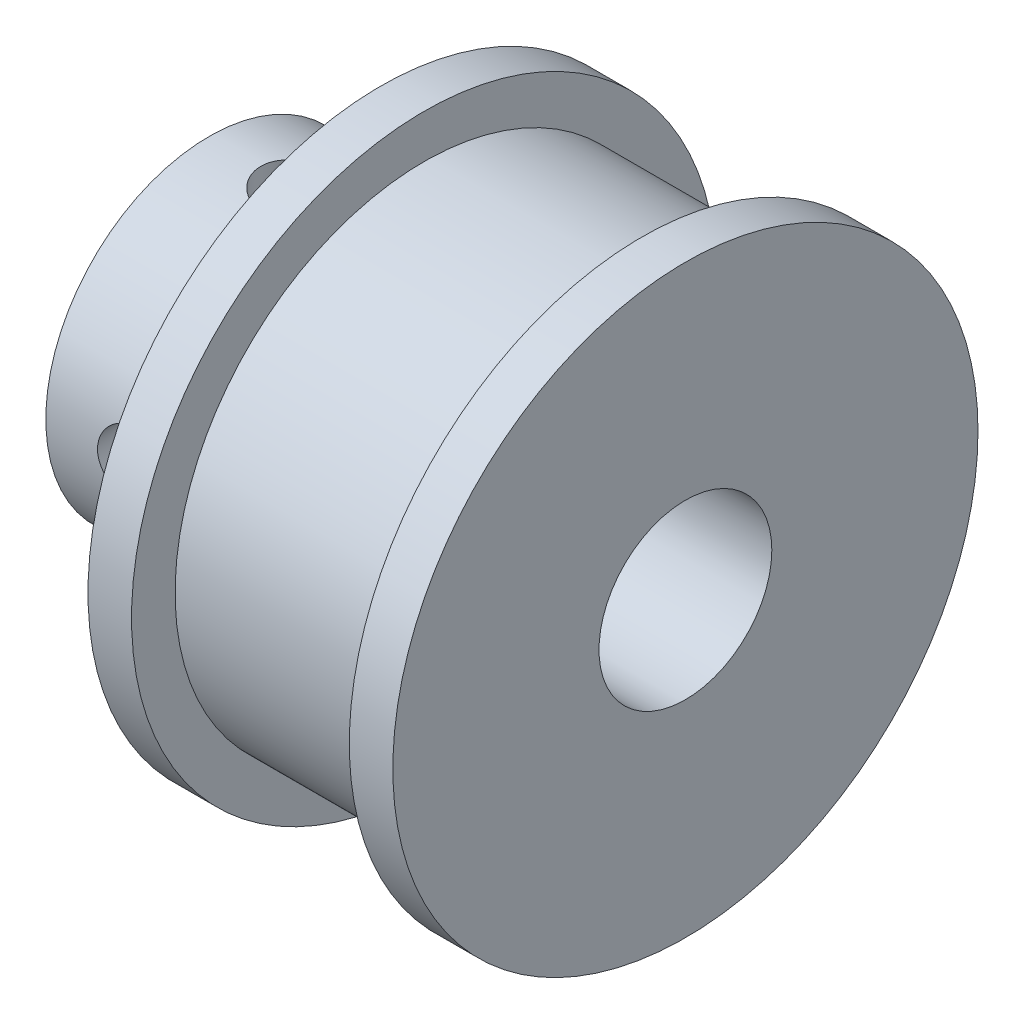
ISO-10303-21;
HEADER;
FILE_DESCRIPTION(('STEP AP214'),'2;1');
FILE_NAME('part.step','',(''),(''),'','','');
FILE_SCHEMA(('AUTOMOTIVE_DESIGN { 1 0 10303 214 1 1 1 1 }'));
ENDSEC;
DATA;
#1=APPLICATION_CONTEXT('core data for automotive mechanical design processes');
#2=APPLICATION_PROTOCOL_DEFINITION('international standard','automotive_design',2000,#1);
#3=PRODUCT_CONTEXT('',#1,'mechanical');
#4=PRODUCT('Part','Part','',(#3));
#5=PRODUCT_RELATED_PRODUCT_CATEGORY('part','',(#4));
#6=PRODUCT_DEFINITION_FORMATION('','',#4);
#7=PRODUCT_DEFINITION_CONTEXT('part definition',#1,'design');
#8=PRODUCT_DEFINITION('design','',#6,#7);
#9=PRODUCT_DEFINITION_SHAPE('','',#8);
#10=(LENGTH_UNIT() NAMED_UNIT(*) SI_UNIT(.MILLI.,.METRE.));
#11=(NAMED_UNIT(*) PLANE_ANGLE_UNIT() SI_UNIT($,.RADIAN.));
#12=(NAMED_UNIT(*) SI_UNIT($,.STERADIAN.) SOLID_ANGLE_UNIT());
#13=UNCERTAINTY_MEASURE_WITH_UNIT(LENGTH_MEASURE(1.E-05),#10,'distance_accuracy_value','');
#14=(GEOMETRIC_REPRESENTATION_CONTEXT(3) GLOBAL_UNCERTAINTY_ASSIGNED_CONTEXT((#13)) GLOBAL_UNIT_ASSIGNED_CONTEXT((#10,
#11,#12)) REPRESENTATION_CONTEXT('',''));
#15=CARTESIAN_POINT('',(0.,0.,0.));
#16=DIRECTION('',(0.,0.,1.));
#17=DIRECTION('',(1.,0.,0.));
#18=AXIS2_PLACEMENT_3D('',#15,#16,#17);
#19=CARTESIAN_POINT('',(0.,0.,0.));
#20=DIRECTION('',(1.,0.,0.));
#21=DIRECTION('',(0.,0.,-1.));
#22=AXIS2_PLACEMENT_3D('',#19,#20,#21);
#23=CYLINDRICAL_SURFACE('',#22,3.175);
#24=CARTESIAN_POINT('',(1.90000000000001,0.,3.175));
#25=CARTESIAN_POINT('',(1.9000068627745,0.0672847316330924,3.17499501338285));
#26=CARTESIAN_POINT('',(1.90546359305505,0.1346703640608,3.17283650663751));
#27=CARTESIAN_POINT('',(1.92710352845715,0.267542369031608,3.16441250521978));
#28=CARTESIAN_POINT('',(1.94331412522152,0.333023444641002,3.15813652319774));
#29=CARTESIAN_POINT('',(1.9857829777871,0.459957962416117,3.14215557601542));
#30=CARTESIAN_POINT('',(2.01200951215206,0.521423409993961,3.1324614438269));
#31=CARTESIAN_POINT('',(2.07364090841074,0.63903164640658,3.11060223187218));
#32=CARTESIAN_POINT('',(2.1090429677438,0.695176053354679,3.09843790684371));
#33=CARTESIAN_POINT('',(2.1897376821198,0.803199302091193,3.07224897424454));
#34=CARTESIAN_POINT('',(2.23538195508738,0.854801684849634,3.05816785515032));
#35=CARTESIAN_POINT('',(2.33452307874792,0.949851027050096,3.029995134943));
#36=CARTESIAN_POINT('',(2.38802352829044,0.993294227940917,3.01590353198658));
#37=CARTESIAN_POINT('',(2.5041424024409,1.07262244667806,2.98863572549245));
#38=CARTESIAN_POINT('',(2.56705314443539,1.10810421355732,2.97552454842956));
#39=CARTESIAN_POINT('',(2.698544027874,1.16785949338492,2.95258553832485));
#40=CARTESIAN_POINT('',(2.7671215628923,1.19213812572271,2.94275620617845));
#41=CARTESIAN_POINT('',(2.90482457540723,1.22768807019404,2.92809906106053));
#42=CARTESIAN_POINT('',(2.97379138336201,1.2394876533875,2.92306908743274));
#43=CARTESIAN_POINT('',(3.11289538673181,1.25139521634013,2.91799267608066));
#44=CARTESIAN_POINT('',(3.18303201481214,1.2515087076257,2.91794388907308));
#45=CARTESIAN_POINT('',(3.31747264612622,1.24044215294952,2.92266241514435));
#46=CARTESIAN_POINT('',(3.38185243388379,1.2300187638983,2.9271070555664));
#47=CARTESIAN_POINT('',(3.50786207063953,1.19943319152663,2.93977143360488));
#48=CARTESIAN_POINT('',(3.56949145415953,1.17926936651212,2.94799180758784));
#49=CARTESIAN_POINT('',(3.68970949878321,1.12939589279822,2.9674595549287));
#50=CARTESIAN_POINT('',(3.74821240698525,1.09950293840843,2.97876432051874));
#51=CARTESIAN_POINT('',(3.85958183190654,1.03114819003906,3.00311044973729));
#52=CARTESIAN_POINT('',(3.91244626347388,0.992683242204219,3.01615245182717));
#53=CARTESIAN_POINT('',(4.01519223792226,0.90489847311778,3.04369028436772));
#54=CARTESIAN_POINT('',(4.06455620057866,0.854982538626526,3.05822195069566));
#55=CARTESIAN_POINT('',(4.15437521291328,0.747422600693478,3.08627133748347));
#56=CARTESIAN_POINT('',(4.19482859712145,0.68977715576794,3.09978886808114));
#57=CARTESIAN_POINT('',(4.26632885010501,0.566964697663757,3.12460676760529));
#58=CARTESIAN_POINT('',(4.29718676961865,0.501677729871156,3.13586122258918));
#59=CARTESIAN_POINT('',(4.34730502697112,0.366284378650628,3.15453954285868));
#60=CARTESIAN_POINT('',(4.36657106552982,0.296180383098904,3.16196529078971));
#61=CARTESIAN_POINT('',(4.39192526522841,0.15748598181363,3.17180954080983));
#62=CARTESIAN_POINT('',(4.398709348115,0.08904145870925,3.174492125026));
#63=CARTESIAN_POINT('',(4.4009546291958,-0.0480536320474739,3.17537559014029));
#64=CARTESIAN_POINT('',(4.39641864995898,-0.116704144074904,3.17357758823769));
#65=CARTESIAN_POINT('',(4.3766688987383,-0.249146112043378,3.1658751934269));
#66=CARTESIAN_POINT('',(4.36192521803439,-0.313019327348947,3.16015168509209));
#67=CARTESIAN_POINT('',(4.32281288402532,-0.437330047990826,3.14535985768854));
#68=CARTESIAN_POINT('',(4.29844298886303,-0.497767108885045,3.1362911070673));
#69=CARTESIAN_POINT('',(4.23997777394203,-0.615550644692232,3.11535083253378));
#70=CARTESIAN_POINT('',(4.20560984846939,-0.672747743207499,3.10340262881889));
#71=CARTESIAN_POINT('',(4.12842792642724,-0.780761917259374,3.07800576012949));
#72=CARTESIAN_POINT('',(4.08561060602606,-0.831576469108153,3.06455650557748));
#73=CARTESIAN_POINT('',(3.98952965745297,-0.928791348114859,3.0365593899859));
#74=CARTESIAN_POINT('',(3.93577293586608,-0.974701227513619,3.02199629492691));
#75=CARTESIAN_POINT('',(3.82105274982168,-1.05696284943212,2.99421855171024));
#76=CARTESIAN_POINT('',(3.76008825217309,-1.09331321924023,2.98100409737911));
#77=CARTESIAN_POINT('',(3.63187774635261,-1.15559997165607,2.95742074651155));
#78=CARTESIAN_POINT('',(3.56458459593159,-1.18144907129597,2.9470759174758));
#79=CARTESIAN_POINT('',(3.4260725952737,-1.2212562072246,2.93080697789355));
#80=CARTESIAN_POINT('',(3.35485655568267,-1.23522264211379,2.92487974538276));
#81=CARTESIAN_POINT('',(3.21589405502895,-1.25007804085777,2.91855940228496));
#82=CARTESIAN_POINT('',(3.1482538653394,-1.25181430561831,2.91780781401761));
#83=CARTESIAN_POINT('',(3.01369577979596,-1.24437120429059,2.92098982763324));
#84=CARTESIAN_POINT('',(2.94677779981834,-1.23519312367105,2.92492287776943));
#85=CARTESIAN_POINT('',(2.81810207173594,-1.20686591196944,2.93671925445626));
#86=CARTESIAN_POINT('',(2.75624498467543,-1.18809939057282,2.9444313340829));
#87=CARTESIAN_POINT('',(2.63652982106708,-1.14148049607648,2.96281485611587));
#88=CARTESIAN_POINT('',(2.57867280512971,-1.1136257243581,2.97348707966731));
#89=CARTESIAN_POINT('',(2.4650674647447,-1.04781462002773,2.99733186522452));
#90=CARTESIAN_POINT('',(2.40961923756217,-1.00937948877753,3.01061106475901));
#91=CARTESIAN_POINT('',(2.30568987821778,-0.924206507043676,3.0378387527675));
#92=CARTESIAN_POINT('',(2.25721118976831,-0.877465757163235,3.05178747371865));
#93=CARTESIAN_POINT('',(2.16551587816836,-0.773553196077986,3.07982295515274));
#94=CARTESIAN_POINT('',(2.12281309958007,-0.715913819660185,3.09386447942524));
#95=CARTESIAN_POINT('',(2.04769454049986,-0.5937664037964,3.11960779538581));
#96=CARTESIAN_POINT('',(2.01528012935281,-0.529257451559142,3.13130927554577));
#97=CARTESIAN_POINT('',(1.96417540099936,-0.400855491445671,3.15020502613284));
#98=CARTESIAN_POINT('',(1.94455266817755,-0.337376283301317,3.15769788512325));
#99=CARTESIAN_POINT('',(1.91563614784328,-0.207895662632507,3.16884766902594));
#100=CARTESIAN_POINT('',(1.90631397142025,-0.141901703524203,3.17251513536217));
#101=CARTESIAN_POINT('',(1.90076135384054,-0.0504531001608372,3.17470085654944));
#102=CARTESIAN_POINT('',(1.8999974262687,-0.0252336457199433,3.17500187012012));
#103=CARTESIAN_POINT('',(1.90000000000001,0.,3.175));
#104=B_SPLINE_CURVE_WITH_KNOTS('',3,(#24,#25,#26,#27,#28,#29,#30,#31,#32,#33,#34,#35,#36,#37,
#38,#39,#40,#41,#42,#43,#44,#45,#46,#47,#48,#49,#50,#51,#52,#53,#54,#55,#56,#57,#58,#59,#60,#61,
#62,#63,#64,#65,#66,#67,#68,#69,#70,#71,#72,#73,#74,#75,#76,#77,#78,#79,#80,#81,#82,#83,#84,#85,
#86,#87,#88,#89,#90,#91,#92,#93,#94,#95,#96,#97,#98,#99,#100,#101,#102,#103),.UNSPECIFIED.,.T.,
.F.,(4,2,2,2,2,2,2,2,2,2,2,2,2,2,2,2,2,2,2,2,2,2,2,2,2,2,2,2,2,2,2,2,2,2,2,2,2,2,2,4),(0.,
0.201779437744548,0.404074820308127,0.605734757050763,0.807333171478417,1.01735976436243,
1.2274828705813,1.44660259463333,1.66562209023744,1.87494520835713,2.08416960269575,
2.27936669865592,2.47459670544107,2.67374147234743,2.87295963102294,3.08705517744558,
3.30119070642572,3.51930901537433,3.73731996902137,3.94275765182502,4.14814411546712,
4.34465147529728,4.54118419440118,4.7436789821994,4.94625358697288,5.1617892735487,
5.37735589340512,5.59467927329235,5.81184892233299,6.01381057507249,6.21574844354767,
6.41019345194811,6.60468982086286,6.81009090996547,7.01556384361703,7.2337987698656,
7.45206273023339,7.65177261299093,7.85093070050895,7.92660360165657),.UNSPECIFIED.);
#105=CARTESIAN_POINT('',(1.90000000000001,0.,3.175));
#106=VERTEX_POINT('',#105);
#107=EDGE_CURVE('E708',#106,#106,#104,.T.);
#108=ORIENTED_EDGE('',*,*,#107,.F.);
#109=EDGE_LOOP('',(#108));
#110=FACE_BOUND('',#109,.T.);
#111=CARTESIAN_POINT('',(3.15,2.91858270398493,-1.25));
#112=CARTESIAN_POINT('',(3.21705876770274,2.91858919552523,-1.24999286391997));
#113=CARTESIAN_POINT('',(3.28421776991305,2.92092645038722,-1.24457161253238));
#114=CARTESIAN_POINT('',(3.41661509708975,2.92998517442319,-1.2230858011541));
#115=CARTESIAN_POINT('',(3.48184795863823,2.93671805691524,-1.20699353198018));
#116=CARTESIAN_POINT('',(3.60825570633315,2.95367783504784,-1.16486992778129));
#117=CARTESIAN_POINT('',(3.66944461339327,2.96389181028401,-1.13887530486567));
#118=CARTESIAN_POINT('',(3.78657755098346,2.98664490940932,-1.07779173231123));
#119=CARTESIAN_POINT('',(3.84252284402701,2.99918347142755,-1.04270497949831));
#120=CARTESIAN_POINT('',(3.95071189018399,3.02595080926506,-0.962353829492942));
#121=CARTESIAN_POINT('',(4.00262881457917,3.04023283739072,-0.916666915264533));
#122=CARTESIAN_POINT('',(4.09830169841413,3.06843728874988,-0.817302314146456));
#123=CARTESIAN_POINT('',(4.1420548518516,3.08235958692784,-0.763621891133198));
#124=CARTESIAN_POINT('',(4.22176349783716,3.10891201177461,-0.64728579706301));
#125=CARTESIAN_POINT('',(4.25735944266869,3.12147292007291,-0.584366556004033));
#126=CARTESIAN_POINT('',(4.31732314068053,3.14324422109986,-0.452850465301555));
#127=CARTESIAN_POINT('',(4.34169532800117,3.15245593668199,-0.384255870461471));
#128=CARTESIAN_POINT('',(4.37736018254707,3.16611423056324,-0.2467608971739));
#129=CARTESIAN_POINT('',(4.38921442617454,3.17076466636064,-0.178026840226493));
#130=CARTESIAN_POINT('',(4.40131288966092,3.17551190440968,-0.0393983009347702));
#131=CARTESIAN_POINT('',(4.40156129942229,3.17561035000669,0.0304957535146294));
#132=CARTESIAN_POINT('',(4.39075388885007,3.17136802875332,0.165409649899385));
#133=CARTESIAN_POINT('',(4.380312782763,3.16726865978232,0.230487686315578));
#134=CARTESIAN_POINT('',(4.34946532592636,3.15541444614498,0.357881536818985));
#135=CARTESIAN_POINT('',(4.32905824593686,3.14765933397851,0.420197148407344));
#136=CARTESIAN_POINT('',(4.27860558354179,3.12910832817148,0.541410179653869));
#137=CARTESIAN_POINT('',(4.24842031728481,3.11826866169305,0.600242482304685));
#138=CARTESIAN_POINT('',(4.17939703639771,3.09462975143761,0.712157346885298));
#139=CARTESIAN_POINT('',(4.1405560971742,3.08182984578998,0.765237956392509));
#140=CARTESIAN_POINT('',(4.05243182003348,3.05461022779038,0.867739124124568));
#141=CARTESIAN_POINT('',(4.00264013608172,3.04013927358102,0.916709689716655));
#142=CARTESIAN_POINT('',(3.89548656480707,3.01184461230875,1.00578635680649));
#143=CARTESIAN_POINT('',(3.83812236311636,2.99802110488019,1.04588973818711));
#144=CARTESIAN_POINT('',(3.71550154425415,2.9722444532213,1.11707822475766));
#145=CARTESIAN_POINT('',(3.6500754582507,2.96035090580402,1.14789479354929));
#146=CARTESIAN_POINT('',(3.5143696785953,2.94047661183176,1.19789603572418));
#147=CARTESIAN_POINT('',(3.44409305117512,2.93249341875955,1.21708798384633));
#148=CARTESIAN_POINT('',(3.30516034266536,2.92193314346724,1.24221885837745));
#149=CARTESIAN_POINT('',(3.2366574611002,2.9190621155793,1.24887973581001));
#150=CARTESIAN_POINT('',(3.09946758767574,2.91821507641654,1.25085924710212));
#151=CARTESIAN_POINT('',(3.03078065469026,2.92023765193577,1.24618115550066));
#152=CARTESIAN_POINT('',(2.89910081239854,2.92864903711891,1.22627220656949));
#153=CARTESIAN_POINT('',(2.83600149325999,2.93479414330475,1.21162973372095));
#154=CARTESIAN_POINT('',(2.71319369775327,2.95045928061593,1.17296502005911));
#155=CARTESIAN_POINT('',(2.65348596177989,2.95998004539956,1.14894074010909));
#156=CARTESIAN_POINT('',(2.53650689226705,2.98178824537218,1.09112415058302));
#157=CARTESIAN_POINT('',(2.47942723563771,2.99417074871089,1.05698098829747));
#158=CARTESIAN_POINT('',(2.37155358654007,3.02015852173764,0.980258179031947));
#159=CARTESIAN_POINT('',(2.32076210314278,3.03376427580628,0.937675181950988));
#160=CARTESIAN_POINT('',(2.22315311375844,3.06183438952279,0.841703377564378));
#161=CARTESIAN_POINT('',(2.17687527629868,3.07629098175068,0.787761391689884));
#162=CARTESIAN_POINT('',(2.09394958907587,3.1035190255834,0.672529083864432));
#163=CARTESIAN_POINT('',(2.05730202921282,3.1162904264532,0.611238540780897));
#164=CARTESIAN_POINT('',(1.99484313276734,3.13873566281396,0.482904338615098));
#165=CARTESIAN_POINT('',(1.96901930828488,3.14841306493411,0.415867417631866));
#166=CARTESIAN_POINT('',(1.92917965457089,3.16357142711523,0.277927786036162));
#167=CARTESIAN_POINT('',(1.91515764017672,3.16905458518296,0.207027121129187));
#168=CARTESIAN_POINT('',(1.90003726977397,3.17497850608976,0.0682260342168539));
#169=CARTESIAN_POINT('',(1.89817498964644,3.17571727826717,0.000420884757595325));
#170=CARTESIAN_POINT('',(1.90542306137319,3.1728670277863,-0.134500374630681));
#171=CARTESIAN_POINT('',(1.9145318409792,3.16927862524971,-0.201616581901098));
#172=CARTESIAN_POINT('',(1.94291936225415,3.15832315585951,-0.331261459507754));
#173=CARTESIAN_POINT('',(1.96189513645233,3.15106882901496,-0.393866748155006));
#174=CARTESIAN_POINT('',(2.00916415022582,3.13355246801338,-0.514998013360591));
#175=CARTESIAN_POINT('',(2.03745913359075,3.12328987099511,-0.573523223978585));
#176=CARTESIAN_POINT('',(2.10396081746341,3.10021124636329,-0.687642991756168));
#177=CARTESIAN_POINT('',(2.14254680575914,3.08730319204293,-0.742997519181306));
#178=CARTESIAN_POINT('',(2.22796048608835,3.0604965861267,-0.846674739986252));
#179=CARTESIAN_POINT('',(2.27479143506869,3.04659764440369,-0.894994640697079));
#180=CARTESIAN_POINT('',(2.3786645370051,3.01835076024438,-0.986204093974814));
#181=CARTESIAN_POINT('',(2.43614870477354,3.00402537078839,-1.02859889387657));
#182=CARTESIAN_POINT('',(2.55787929604743,2.97745127531598,-1.10316965268165));
#183=CARTESIAN_POINT('',(2.62212660256846,2.96520284101944,-1.13534427499941));
#184=CARTESIAN_POINT('',(2.74980593068555,2.94527735121899,-1.18601952811124));
#185=CARTESIAN_POINT('',(2.81281216952646,2.93729286701932,-1.20547430735444));
#186=CARTESIAN_POINT('',(2.94135798876503,2.92533709276108,-1.23421212719399));
#187=CARTESIAN_POINT('',(3.00688989438575,2.92135450819833,-1.24352380081826));
#188=CARTESIAN_POINT('',(3.09843968257498,2.91892238480656,-1.24920484852849));
#189=CARTESIAN_POINT('',(3.12421242994352,2.91858020765141,-1.25000274419244));
#190=CARTESIAN_POINT('',(3.15,2.91858270398493,-1.25));
#191=B_SPLINE_CURVE_WITH_KNOTS('',3,(#111,#112,#113,#114,#115,#116,#117,#118,#119,#120,#121,
#122,#123,#124,#125,#126,#127,#128,#129,#130,#131,#132,#133,#134,#135,#136,#137,#138,#139,#140,
#141,#142,#143,#144,#145,#146,#147,#148,#149,#150,#151,#152,#153,#154,#155,#156,#157,#158,#159,
#160,#161,#162,#163,#164,#165,#166,#167,#168,#169,#170,#171,#172,#173,#174,#175,#176,#177,#178,
#179,#180,#181,#182,#183,#184,#185,#186,#187,#188,#189,#190),.UNSPECIFIED.,.T.,.F.,(4,2,2,2,2,2,
2,2,2,2,2,2,2,2,2,2,2,2,2,2,2,2,2,2,2,2,2,2,2,2,2,2,2,2,2,2,2,2,2,4),(0.,0.20109806062216,
0.402720363484106,0.603602331741175,0.804435808400704,1.01535170829682,1.22633996993093,
1.44534686764129,1.66426716849029,1.87288447318198,2.08142646291369,2.27861453584364,
2.47581703977309,2.67597098178837,2.87619265497002,3.08919652800103,3.30226565219754,
3.52100766319138,3.73961264265535,3.94518390476032,4.1506958077731,4.34501913391243,
4.5393847197749,4.74148953365143,4.94367473209367,5.16024174600764,5.37681527848653,
5.59313824650931,5.80934777198827,6.01183163883026,6.21428649142563,6.41086299855999,
6.60747630956881,6.81268639074811,7.01797771720266,7.23549456942807,7.45303985660975,
7.65144122721413,7.84928106635439,7.92661368823473),.UNSPECIFIED.);
#192=CARTESIAN_POINT('',(3.15,2.91858270398493,-1.25));
#193=VERTEX_POINT('',#192);
#194=EDGE_CURVE('E724',#193,#193,#191,.T.);
#195=ORIENTED_EDGE('',*,*,#194,.F.);
#196=EDGE_LOOP('',(#195));
#197=FACE_BOUND('',#196,.T.);
#198=CARTESIAN_POINT('',(17.5,0.,0.));
#199=DIRECTION('',(1.,0.,0.));
#200=DIRECTION('',(0.,0.,-1.));
#201=AXIS2_PLACEMENT_3D('',#198,#199,#200);
#202=CIRCLE('',#201,3.175);
#203=CARTESIAN_POINT('',(17.5,0.,-3.175));
#204=VERTEX_POINT('',#203);
#205=EDGE_CURVE('E750',#204,#204,#202,.T.);
#206=ORIENTED_EDGE('',*,*,#205,.T.);
#207=EDGE_LOOP('',(#206));
#208=FACE_BOUND('',#207,.T.);
#209=CARTESIAN_POINT('',(0.,0.,0.));
#210=DIRECTION('',(1.,0.,0.));
#211=DIRECTION('',(0.,0.,-1.));
#212=AXIS2_PLACEMENT_3D('',#209,#210,#211);
#213=CIRCLE('',#212,3.175);
#214=CARTESIAN_POINT('',(0.,0.,-3.175));
#215=VERTEX_POINT('',#214);
#216=EDGE_CURVE('E12',#215,#215,#213,.T.);
#217=ORIENTED_EDGE('',*,*,#216,.F.);
#218=EDGE_LOOP('',(#217));
#219=FACE_BOUND('',#218,.T.);
#220=ADVANCED_FACE('F704',(#110,#197,#208,#219),#23,.F.);
#221=CARTESIAN_POINT('',(0.,3.175,0.));
#222=DIRECTION('',(-1.,0.,0.));
#223=DIRECTION('',(0.,0.,1.));
#224=AXIS2_PLACEMENT_3D('',#221,#222,#223);
#225=PLANE('',#224);
#226=ORIENTED_EDGE('',*,*,#216,.T.);
#227=EDGE_LOOP('',(#226));
#228=FACE_BOUND('',#227,.T.);
#229=CARTESIAN_POINT('',(0.,0.,0.));
#230=DIRECTION('',(1.,0.,0.));
#231=DIRECTION('',(0.,0.,-1.));
#232=AXIS2_PLACEMENT_3D('',#229,#230,#231);
#233=CIRCLE('',#232,6.);
#234=CARTESIAN_POINT('',(0.,0.,-6.));
#235=VERTEX_POINT('',#234);
#236=EDGE_CURVE('E716',#235,#235,#233,.T.);
#237=ORIENTED_EDGE('',*,*,#236,.F.);
#238=EDGE_LOOP('',(#237));
#239=FACE_BOUND('',#238,.T.);
#240=ADVANCED_FACE('F760',(#228,#239),#225,.T.);
#241=CARTESIAN_POINT('',(0.,0.,0.));
#242=DIRECTION('',(1.,0.,0.));
#243=DIRECTION('',(0.,0.,-1.));
#244=AXIS2_PLACEMENT_3D('',#241,#242,#243);
#245=CYLINDRICAL_SURFACE('',#244,6.);
#246=CARTESIAN_POINT('',(1.90000000000001,0.,6.));
#247=CARTESIAN_POINT('',(1.90000247746923,-0.0694090417016603,5.99999871526651));
#248=CARTESIAN_POINT('',(1.90580066571876,-0.138848789520875,5.99878328775043));
#249=CARTESIAN_POINT('',(1.92881934953286,-0.275761316266992,5.99405200990679));
#250=CARTESIAN_POINT('',(1.94604852303694,-0.343232560128311,5.99053441189248));
#251=CARTESIAN_POINT('',(1.99137045492183,-0.474209132291339,5.98159109196202));
#252=CARTESIAN_POINT('',(2.01945239599889,-0.537718336709182,5.97616727052645));
#253=CARTESIAN_POINT('',(2.08564960885619,-0.659120328605954,5.96399927809859));
#254=CARTESIAN_POINT('',(2.12376443115584,-0.717013367534323,5.95725516625975));
#255=CARTESIAN_POINT('',(2.20953634019065,-0.826390324308832,5.9430770002465));
#256=CARTESIAN_POINT('',(2.25731200123509,-0.87778024416268,5.93563505848531));
#257=CARTESIAN_POINT('',(2.36079465919511,-0.971877776769387,5.92095657692448));
#258=CARTESIAN_POINT('',(2.41650231187227,-1.01458467096098,5.91372005416683));
#259=CARTESIAN_POINT('',(2.53495196876616,-1.09051031677216,5.90019442595308));
#260=CARTESIAN_POINT('',(2.59775838450275,-1.1236305468065,5.89391545174828));
#261=CARTESIAN_POINT('',(2.72819745177276,-1.17881119348063,5.8831284065002));
#262=CARTESIAN_POINT('',(2.79582958244254,-1.20087280167641,5.87862014467568));
#263=CARTESIAN_POINT('',(2.93298523741564,-1.23300240133736,5.87196500986123));
#264=CARTESIAN_POINT('',(3.00246835933477,-1.24323597696798,5.86978556855865));
#265=CARTESIAN_POINT('',(3.14219684286263,-1.25193357655614,5.86793690716491));
#266=CARTESIAN_POINT('',(3.2124421188653,-1.25039890894686,5.86826740800981));
#267=CARTESIAN_POINT('',(3.35048102797518,-1.23573719037196,5.87137174319175));
#268=CARTESIAN_POINT('',(3.41829597966121,-1.2228010523272,5.87410533679901));
#269=CARTESIAN_POINT('',(3.55077150964493,-1.18600543529945,5.88164437615942));
#270=CARTESIAN_POINT('',(3.61543192560633,-1.16214539481381,5.88644992841317));
#271=CARTESIAN_POINT('',(3.74030722841598,-1.10400003213928,5.89763191464102));
#272=CARTESIAN_POINT('',(3.80048629652707,-1.06964002534236,5.90401953785586));
#273=CARTESIAN_POINT('',(3.91429574426816,-0.991522699274812,5.91763890010721));
#274=CARTESIAN_POINT('',(3.96792530883597,-0.947764212262582,5.92487074398537));
#275=CARTESIAN_POINT('',(4.06821396108037,-0.851074921546777,5.93953730929909));
#276=CARTESIAN_POINT('',(4.11471616889701,-0.797981433412077,5.94697323199473));
#277=CARTESIAN_POINT('',(4.19818044222897,-0.684667288611794,5.96108088143001));
#278=CARTESIAN_POINT('',(4.23514236459839,-0.624446525025762,5.96775259670236));
#279=CARTESIAN_POINT('',(4.29851008153595,-0.498405541235475,5.97959870942815));
#280=CARTESIAN_POINT('',(4.32489680456711,-0.432575461926497,5.98477039710258));
#281=CARTESIAN_POINT('',(4.36619170483549,-0.297284620972153,5.99301338211281));
#282=CARTESIAN_POINT('',(4.38110139323139,-0.227824338595088,5.99608495596053));
#283=CARTESIAN_POINT('',(4.39879425206788,-0.0885918657008349,5.99974275215455));
#284=CARTESIAN_POINT('',(4.40179194149424,-0.0188480555261788,6.00037293537579));
#285=CARTESIAN_POINT('',(4.39615505003089,0.120143798757714,5.99919952252774));
#286=CARTESIAN_POINT('',(4.3875211813984,0.189391872962257,5.99739607548153));
#287=CARTESIAN_POINT('',(4.35904434653046,0.324726367119811,5.99158564979184));
#288=CARTESIAN_POINT('',(4.33931251461653,0.390837192894204,5.98760052868077));
#289=CARTESIAN_POINT('',(4.28932213957859,0.518811446661328,5.97787227242395));
#290=CARTESIAN_POINT('',(4.25906275913401,0.580674536336772,5.97212899744579));
#291=CARTESIAN_POINT('',(4.18841962176244,0.69929430694349,5.95941241490714));
#292=CARTESIAN_POINT('',(4.14790807043093,0.755973219469829,5.9524239381233));
#293=CARTESIAN_POINT('',(4.05808043692373,0.861805445886515,5.93802568299709));
#294=CARTESIAN_POINT('',(4.00876332448106,0.910957877913281,5.93061585542511));
#295=CARTESIAN_POINT('',(3.9017444230003,1.0011786486518,5.91606024531377));
#296=CARTESIAN_POINT('',(3.84391696804472,1.04209914600204,5.90892089307501));
#297=CARTESIAN_POINT('',(3.72208371578621,1.11364719079243,5.89585601015805));
#298=CARTESIAN_POINT('',(3.65807817586089,1.14427516677863,5.88993042894651));
#299=CARTESIAN_POINT('',(3.52603880370177,1.19417246443921,5.88001700708041));
#300=CARTESIAN_POINT('',(3.45802896283416,1.21350309828031,5.87601872784687));
#301=CARTESIAN_POINT('',(3.31963344950774,1.24044038523407,5.87039184709697));
#302=CARTESIAN_POINT('',(3.24924811838056,1.2480487154444,5.86876290660367));
#303=CARTESIAN_POINT('',(3.10958659900035,1.25125926487611,5.86807907308506));
#304=CARTESIAN_POINT('',(3.04031592977795,1.24709542622725,5.86897402321502));
#305=CARTESIAN_POINT('',(2.90348599107978,1.22739905314031,5.87312447254928));
#306=CARTESIAN_POINT('',(2.8359267051839,1.21186662782265,5.87637994909626));
#307=CARTESIAN_POINT('',(2.70460222810934,1.16998217768584,5.88486132447716));
#308=CARTESIAN_POINT('',(2.64082675351308,1.14366117568421,5.8900815700793));
#309=CARTESIAN_POINT('',(2.51856122397334,1.08097457299757,5.90190705738738));
#310=CARTESIAN_POINT('',(2.46007166036688,1.04460803983029,5.9085124276546));
#311=CARTESIAN_POINT('',(2.34887837292056,0.962073695342405,5.92251579551146));
#312=CARTESIAN_POINT('',(2.29630087543502,0.91573789041822,5.92992613868404));
#313=CARTESIAN_POINT('',(2.19959050677365,0.814924438115329,5.94461839583213));
#314=CARTESIAN_POINT('',(2.15545958244852,0.760444918832963,5.9519002798488));
#315=CARTESIAN_POINT('',(2.07641142681595,0.644134427507699,5.96561444547637));
#316=CARTESIAN_POINT('',(2.04160632011372,0.582225921521345,5.97203596073244));
#317=CARTESIAN_POINT('',(1.98294977156998,0.453319843998451,5.98319908494092));
#318=CARTESIAN_POINT('',(1.95908875281813,0.386326781907242,5.98794216182101));
#319=CARTESIAN_POINT('',(1.92745972171158,0.266015292900104,5.99432499781443));
#320=CARTESIAN_POINT('',(1.91718123679115,0.213367593727928,5.99644035661395));
#321=CARTESIAN_POINT('',(1.90345054572268,0.107152674176536,5.99927832789758));
#322=CARTESIAN_POINT('',(1.89999808733282,0.0535854878488715,6.00000099184586));
#323=CARTESIAN_POINT('',(1.90000000000001,0.,6.));
#324=B_SPLINE_CURVE_WITH_KNOTS('',3,(#246,#247,#248,#249,#250,#251,#252,#253,#254,#255,#256,
#257,#258,#259,#260,#261,#262,#263,#264,#265,#266,#267,#268,#269,#270,#271,#272,#273,#274,#275,
#276,#277,#278,#279,#280,#281,#282,#283,#284,#285,#286,#287,#288,#289,#290,#291,#292,#293,#294,
#295,#296,#297,#298,#299,#300,#301,#302,#303,#304,#305,#306,#307,#308,#309,#310,#311,#312,#313,
#314,#315,#316,#317,#318,#319,#320,#321,#322,#323),.UNSPECIFIED.,.T.,.F.,(4,2,2,2,2,2,2,2,2,2,2,
2,2,2,2,2,2,2,2,2,2,2,2,2,2,2,2,2,2,2,2,2,2,2,2,2,2,2,4),(0.,0.208031045103182,
0.416220199906223,0.624202378825439,0.832175241572985,1.04287526388122,1.25359271551785,
1.46640449178548,1.67919333285489,1.88896575169853,2.09871484767163,2.30501712129058,
2.51133000030278,2.71914592416748,2.92698768368033,3.13889526355464,3.35080602278216,
3.5630972449966,3.77536051045769,3.98378339407673,4.19219351552275,4.39855286632619,
4.60492863390931,4.81401583995734,5.02312752564571,5.23571263829333,5.44828889851306,
5.65970050095022,5.87108185414182,6.07829223291035,6.28550062281358,6.49211731393252,
6.69875319081476,6.90919024830305,7.11967575117366,7.33258864398252,7.54531486464969,
7.70592588477276,7.86653096973387),.UNSPECIFIED.);
#325=CARTESIAN_POINT('',(1.90000000000001,0.,6.));
#326=VERTEX_POINT('',#325);
#327=EDGE_CURVE('E731',#326,#326,#324,.T.);
#328=ORIENTED_EDGE('',*,*,#327,.F.);
#329=EDGE_LOOP('',(#328));
#330=FACE_BOUND('',#329,.T.);
#331=CARTESIAN_POINT('',(3.15,5.86834729715275,-1.25));
#332=CARTESIAN_POINT('',(3.08060938484897,5.86834869213645,-1.24999750877599));
#333=CARTESIAN_POINT('',(3.01118802798478,5.86959145924544,-1.24420229433948));
#334=CARTESIAN_POINT('',(2.87431368268275,5.87442015581798,-1.22119649233779));
#335=CARTESIAN_POINT('',(2.80686224449358,5.87800788138388,-1.20397715440342));
#336=CARTESIAN_POINT('',(2.67592762716513,5.8871029296193,-1.1586839750723));
#337=CARTESIAN_POINT('',(2.6124404040082,5.89260825706945,-1.13062141248932));
#338=CARTESIAN_POINT('',(2.4910755003544,5.90491581335741,-1.06446988601732));
#339=CARTESIAN_POINT('',(2.43319759326998,5.91171798977622,-1.0263813273582));
#340=CARTESIAN_POINT('',(2.32380462484654,5.92596934661468,-0.940636399466082));
#341=CARTESIAN_POINT('',(2.27238810637353,5.93342614373039,-0.892855554869668));
#342=CARTESIAN_POINT('',(2.1782389313519,5.94807966802575,-0.789351223880636));
#343=CARTESIAN_POINT('',(2.13550691170856,5.95527637609915,-0.733627155456002));
#344=CARTESIAN_POINT('',(2.05955411191714,5.96868135118848,-0.615162052999588));
#345=CARTESIAN_POINT('',(2.02642747353674,5.97487958631242,-0.552359428204941));
#346=CARTESIAN_POINT('',(1.97123394714022,5.98550347343302,-0.421928551006719));
#347=CARTESIAN_POINT('',(1.94916593484647,5.98992930561222,-0.354300789950591));
#348=CARTESIAN_POINT('',(1.91702423888253,5.99645589892179,-0.217162904200502));
#349=CARTESIAN_POINT('',(1.90678398280484,5.99858891959926,-0.147693380916357));
#350=CARTESIAN_POINT('',(1.89806830424298,6.00040112580612,-0.00799184883952432));
#351=CARTESIAN_POINT('',(1.8995916558069,6.0000805670369,0.0622400797368385));
#352=CARTESIAN_POINT('',(1.91423460095674,5.99704658090511,0.200326586199572));
#353=CARTESIAN_POINT('',(1.92717471895812,5.99437018956584,0.268201128726475));
#354=CARTESIAN_POINT('',(1.96399862533131,5.98696720898885,0.400793746289752));
#355=CARTESIAN_POINT('',(1.98788287720308,5.98224053291904,0.465511687511022));
#356=CARTESIAN_POINT('',(2.0460800521255,5.97120767323924,0.590460005384683));
#357=CARTESIAN_POINT('',(2.08046229420966,5.96489104125346,0.65065713498165));
#358=CARTESIAN_POINT('',(2.15862800284042,5.95137300440189,0.764493456510647));
#359=CARTESIAN_POINT('',(2.20241263820613,5.94417148958325,0.818131831816418));
#360=CARTESIAN_POINT('',(2.29912162489106,5.92951700233276,0.918394203276912));
#361=CARTESIAN_POINT('',(2.35220305998195,5.92206184975925,0.964866487494794));
#362=CARTESIAN_POINT('',(2.4654820489948,5.90786872648996,1.04827597240488));
#363=CARTESIAN_POINT('',(2.52567976138724,5.9011307717716,1.0852129606998));
#364=CARTESIAN_POINT('',(2.6517122548288,5.88912998409156,1.14856217138454));
#365=CARTESIAN_POINT('',(2.71756065069343,5.88387085232125,1.17494805489727));
#366=CARTESIAN_POINT('',(2.85289161936939,5.8754760641036,1.21623577538673));
#367=CARTESIAN_POINT('',(2.92237367280809,5.87234010507182,1.23113924882349));
#368=CARTESIAN_POINT('',(3.06161970631891,5.86860783239132,1.24880863867017));
#369=CARTESIAN_POINT('',(3.13135458453703,5.86796551863474,1.25179442917998));
#370=CARTESIAN_POINT('',(3.27032581154014,5.86916952018704,1.24613693439294));
#371=CARTESIAN_POINT('',(3.33956219090234,5.87101568152623,1.23749436857863));
#372=CARTESIAN_POINT('',(3.47482051605812,5.87694538226166,1.20901558325484));
#373=CARTESIAN_POINT('',(3.54086866717883,5.88100511282998,1.18929841376871));
#374=CARTESIAN_POINT('',(3.6687239894416,5.8908833850312,1.13935810860919));
#375=CARTESIAN_POINT('',(3.7305307856504,5.89670208191057,1.10913404556146));
#376=CARTESIAN_POINT('',(3.84910644121623,5.90954501937191,1.03854598181485));
#377=CARTESIAN_POINT('',(3.90579220446617,5.91658506648323,0.998045327353962));
#378=CARTESIAN_POINT('',(4.01164324915506,5.93103483993908,0.908234440569878));
#379=CARTESIAN_POINT('',(4.06080768623923,5.93844460766532,0.858923220505172));
#380=CARTESIAN_POINT('',(4.15106271309716,5.95294924316736,0.751900450843339));
#381=CARTESIAN_POINT('',(4.19200409502638,5.9600367471991,0.694061907614551));
#382=CARTESIAN_POINT('',(4.26358875208798,5.97296708772407,0.57220010221636));
#383=CARTESIAN_POINT('',(4.29423248223745,5.97880997920818,0.508177113476881));
#384=CARTESIAN_POINT('',(4.34413867931735,5.98856148270679,0.376142117847919));
#385=CARTESIAN_POINT('',(4.36346916554434,5.99248163136497,0.308156710970195));
#386=CARTESIAN_POINT('',(4.3904144040081,5.99799561410226,0.169813400503473));
#387=CARTESIAN_POINT('',(4.39803069353274,5.99958975342889,0.0994558094616958));
#388=CARTESIAN_POINT('',(4.40126762204851,6.00026408056941,-0.0402133434703387));
#389=CARTESIAN_POINT('',(4.39711189999473,5.99939113754811,-0.109519592177922));
#390=CARTESIAN_POINT('',(4.37741936134707,5.99532874094472,-0.246422870373552));
#391=CARTESIAN_POINT('',(4.36188271359323,5.99213932172839,-0.314019925202702));
#392=CARTESIAN_POINT('',(4.31997220535144,5.98380460077544,-0.445431965492052));
#393=CARTESIAN_POINT('',(4.29362733614689,5.97866453407556,-0.509256550004524));
#394=CARTESIAN_POINT('',(4.230877602268,5.96697995347704,-0.631610567220741));
#395=CARTESIAN_POINT('',(4.19447186165686,5.96043531730246,-0.690139538279511));
#396=CARTESIAN_POINT('',(4.11189033200669,5.94651596786386,-0.80134032129826));
#397=CARTESIAN_POINT('',(4.0655557119433,5.93912880302851,-0.853892633615926));
#398=CARTESIAN_POINT('',(3.96475549900292,5.9244278681135,-0.950552741980385));
#399=CARTESIAN_POINT('',(3.91028797005157,5.91711411595368,-0.994658521571232));
#400=CARTESIAN_POINT('',(3.79399089756656,5.90329191643327,-1.07367451852767));
#401=CARTESIAN_POINT('',(3.73208158853791,5.89679406702551,-1.10846928126994));
#402=CARTESIAN_POINT('',(3.60317484391674,5.88547039658063,-1.16710627925306));
#403=CARTESIAN_POINT('',(3.53618195154699,5.88064310352601,-1.1909581629246));
#404=CARTESIAN_POINT('',(3.41589371843157,5.87414004405196,-1.22256554131861));
#405=CARTESIAN_POINT('',(3.36327046340695,5.87198163591589,-1.2328344900567));
#406=CARTESIAN_POINT('',(3.25710421947899,5.86908475266778,-1.24655254358404));
#407=CARTESIAN_POINT('',(3.20356126768996,5.86834622039193,-1.25000192292741));
#408=CARTESIAN_POINT('',(3.15,5.86834729715275,-1.25));
#409=B_SPLINE_CURVE_WITH_KNOTS('',3,(#331,#332,#333,#334,#335,#336,#337,#338,#339,#340,#341,
#342,#343,#344,#345,#346,#347,#348,#349,#350,#351,#352,#353,#354,#355,#356,#357,#358,#359,#360,
#361,#362,#363,#364,#365,#366,#367,#368,#369,#370,#371,#372,#373,#374,#375,#376,#377,#378,#379,
#380,#381,#382,#383,#384,#385,#386,#387,#388,#389,#390,#391,#392,#393,#394,#395,#396,#397,#398,
#399,#400,#401,#402,#403,#404,#405,#406,#407,#408),.UNSPECIFIED.,.T.,.F.,(4,2,2,2,2,2,2,2,2,2,2,
2,2,2,2,2,2,2,2,2,2,2,2,2,2,2,2,2,2,2,2,2,2,2,2,2,2,2,4),(0.,0.207975654071269,0.41611079241747,
0.624030014802729,0.831940834815791,1.04271333467885,1.25350128663874,1.46629026266844,
1.67905760106933,1.88879048859264,2.09850151896339,2.30497341416461,2.5114540545587,
2.71932871977949,2.9272292410426,3.13905862244913,3.35089272191628,3.56325237332487,
3.77558175387597,3.98397516009792,4.19235567296524,4.39853786231922,4.60473825464031,
4.81383917934651,5.02296356082185,5.23559458753343,5.4482162175904,5.65954599648534,
5.87084803959581,6.07816293922644,6.28547476332981,6.492234105851,6.69901145528173,
6.90938318978573,7.11980508427535,7.33272651358123,7.54545984571988,7.70599867585769,
7.8665310426116),.UNSPECIFIED.);
#410=CARTESIAN_POINT('',(3.15,5.86834729715275,-1.25));
#411=VERTEX_POINT('',#410);
#412=EDGE_CURVE('E730',#411,#411,#409,.T.);
#413=ORIENTED_EDGE('',*,*,#412,.F.);
#414=EDGE_LOOP('',(#413));
#415=FACE_BOUND('',#414,.T.);
#416=ORIENTED_EDGE('',*,*,#236,.T.);
#417=EDGE_LOOP('',(#416));
#418=FACE_BOUND('',#417,.T.);
#419=CARTESIAN_POINT('',(6.3,0.,0.));
#420=DIRECTION('',(1.,0.,0.));
#421=DIRECTION('',(0.,0.,-1.));
#422=AXIS2_PLACEMENT_3D('',#419,#420,#421);
#423=CIRCLE('',#422,6.);
#424=CARTESIAN_POINT('',(6.3,0.,-6.));
#425=VERTEX_POINT('',#424);
#426=EDGE_CURVE('E721',#425,#425,#423,.T.);
#427=ORIENTED_EDGE('',*,*,#426,.F.);
#428=EDGE_LOOP('',(#427));
#429=FACE_BOUND('',#428,.T.);
#430=ADVANCED_FACE('F755',(#330,#415,#418,#429),#245,.T.);
#431=CARTESIAN_POINT('',(6.3,10.75,0.));
#432=DIRECTION('',(-1.,0.,0.));
#433=DIRECTION('',(0.,0.,1.));
#434=AXIS2_PLACEMENT_3D('',#431,#432,#433);
#435=PLANE('',#434);
#436=ORIENTED_EDGE('',*,*,#426,.T.);
#437=EDGE_LOOP('',(#436));
#438=FACE_BOUND('',#437,.T.);
#439=CARTESIAN_POINT('',(6.3,0.,0.));
#440=DIRECTION('',(1.,0.,0.));
#441=DIRECTION('',(0.,0.,-1.));
#442=AXIS2_PLACEMENT_3D('',#439,#440,#441);
#443=CIRCLE('',#442,10.75);
#444=CARTESIAN_POINT('',(6.3,0.,-10.75));
#445=VERTEX_POINT('',#444);
#446=EDGE_CURVE('E776',#445,#445,#443,.T.);
#447=ORIENTED_EDGE('',*,*,#446,.F.);
#448=EDGE_LOOP('',(#447));
#449=FACE_BOUND('',#448,.T.);
#450=ADVANCED_FACE('F759',(#438,#449),#435,.T.);
#451=CARTESIAN_POINT('',(0.,0.,0.));
#452=DIRECTION('',(1.,0.,0.));
#453=DIRECTION('',(0.,0.,-1.));
#454=AXIS2_PLACEMENT_3D('',#451,#452,#453);
#455=CYLINDRICAL_SURFACE('',#454,10.75);
#456=ORIENTED_EDGE('',*,*,#446,.T.);
#457=EDGE_LOOP('',(#456));
#458=FACE_BOUND('',#457,.T.);
#459=CARTESIAN_POINT('',(7.9,0.,0.));
#460=DIRECTION('',(1.,0.,0.));
#461=DIRECTION('',(0.,0.,-1.));
#462=AXIS2_PLACEMENT_3D('',#459,#460,#461);
#463=CIRCLE('',#462,10.75);
#464=CARTESIAN_POINT('',(7.9,0.,-10.75));
#465=VERTEX_POINT('',#464);
#466=EDGE_CURVE('E778',#465,#465,#463,.T.);
#467=ORIENTED_EDGE('',*,*,#466,.F.);
#468=EDGE_LOOP('',(#467));
#469=FACE_BOUND('',#468,.T.);
#470=ADVANCED_FACE('F820',(#458,#469),#455,.T.);
#471=CARTESIAN_POINT('',(7.9,10.75,0.));
#472=DIRECTION('',(1.,0.,0.));
#473=DIRECTION('',(0.,0.,-1.));
#474=AXIS2_PLACEMENT_3D('',#471,#472,#473);
#475=PLANE('',#474);
#476=ORIENTED_EDGE('',*,*,#466,.T.);
#477=EDGE_LOOP('',(#476));
#478=FACE_BOUND('',#477,.T.);
#479=CARTESIAN_POINT('',(7.9,0.,0.));
#480=DIRECTION('',(1.,0.,0.));
#481=DIRECTION('',(0.,0.,-1.));
#482=AXIS2_PLACEMENT_3D('',#479,#480,#481);
#483=CIRCLE('',#482,9.15);
#484=CARTESIAN_POINT('',(7.9,0.,-9.15));
#485=VERTEX_POINT('',#484);
#486=EDGE_CURVE('E783',#485,#485,#483,.T.);
#487=ORIENTED_EDGE('',*,*,#486,.F.);
#488=EDGE_LOOP('',(#487));
#489=FACE_BOUND('',#488,.T.);
#490=ADVANCED_FACE('F817',(#478,#489),#475,.T.);
#491=CARTESIAN_POINT('',(0.,0.,0.));
#492=DIRECTION('',(1.,0.,0.));
#493=DIRECTION('',(0.,0.,-1.));
#494=AXIS2_PLACEMENT_3D('',#491,#492,#493);
#495=CYLINDRICAL_SURFACE('',#494,9.15);
#496=ORIENTED_EDGE('',*,*,#486,.T.);
#497=EDGE_LOOP('',(#496));
#498=FACE_BOUND('',#497,.T.);
#499=CARTESIAN_POINT('',(15.9,0.,0.));
#500=DIRECTION('',(1.,0.,0.));
#501=DIRECTION('',(0.,0.,-1.));
#502=AXIS2_PLACEMENT_3D('',#499,#500,#501);
#503=CIRCLE('',#502,9.15);
#504=CARTESIAN_POINT('',(15.9,0.,-9.15));
#505=VERTEX_POINT('',#504);
#506=EDGE_CURVE('E786',#505,#505,#503,.T.);
#507=ORIENTED_EDGE('',*,*,#506,.F.);
#508=EDGE_LOOP('',(#507));
#509=FACE_BOUND('',#508,.T.);
#510=ADVANCED_FACE('F810',(#498,#509),#495,.T.);
#511=CARTESIAN_POINT('',(15.9,9.15,0.));
#512=DIRECTION('',(-1.,0.,0.));
#513=DIRECTION('',(0.,0.,1.));
#514=AXIS2_PLACEMENT_3D('',#511,#512,#513);
#515=PLANE('',#514);
#516=ORIENTED_EDGE('',*,*,#506,.T.);
#517=EDGE_LOOP('',(#516));
#518=FACE_BOUND('',#517,.T.);
#519=CARTESIAN_POINT('',(15.9,0.,0.));
#520=DIRECTION('',(1.,0.,0.));
#521=DIRECTION('',(0.,0.,-1.));
#522=AXIS2_PLACEMENT_3D('',#519,#520,#521);
#523=CIRCLE('',#522,10.75);
#524=CARTESIAN_POINT('',(15.9,0.,-10.75));
#525=VERTEX_POINT('',#524);
#526=EDGE_CURVE('E789',#525,#525,#523,.T.);
#527=ORIENTED_EDGE('',*,*,#526,.F.);
#528=EDGE_LOOP('',(#527));
#529=FACE_BOUND('',#528,.T.);
#530=ADVANCED_FACE('F805',(#518,#529),#515,.T.);
#531=CARTESIAN_POINT('',(0.,0.,0.));
#532=DIRECTION('',(1.,0.,0.));
#533=DIRECTION('',(0.,0.,-1.));
#534=AXIS2_PLACEMENT_3D('',#531,#532,#533);
#535=CYLINDRICAL_SURFACE('',#534,10.75);
#536=ORIENTED_EDGE('',*,*,#526,.T.);
#537=EDGE_LOOP('',(#536));
#538=FACE_BOUND('',#537,.T.);
#539=CARTESIAN_POINT('',(17.5,0.,0.));
#540=DIRECTION('',(1.,0.,0.));
#541=DIRECTION('',(0.,0.,-1.));
#542=AXIS2_PLACEMENT_3D('',#539,#540,#541);
#543=CIRCLE('',#542,10.75);
#544=CARTESIAN_POINT('',(17.5,0.,-10.75));
#545=VERTEX_POINT('',#544);
#546=EDGE_CURVE('E791',#545,#545,#543,.T.);
#547=ORIENTED_EDGE('',*,*,#546,.F.);
#548=EDGE_LOOP('',(#547));
#549=FACE_BOUND('',#548,.T.);
#550=ADVANCED_FACE('F801',(#538,#549),#535,.T.);
#551=CARTESIAN_POINT('',(17.5,10.75,0.));
#552=DIRECTION('',(1.,0.,0.));
#553=DIRECTION('',(0.,0.,-1.));
#554=AXIS2_PLACEMENT_3D('',#551,#552,#553);
#555=PLANE('',#554);
#556=ORIENTED_EDGE('',*,*,#546,.T.);
#557=EDGE_LOOP('',(#556));
#558=FACE_BOUND('',#557,.T.);
#559=ORIENTED_EDGE('',*,*,#205,.F.);
#560=EDGE_LOOP('',(#559));
#561=FACE_BOUND('',#560,.T.);
#562=ADVANCED_FACE('F737',(#558,#561),#555,.T.);
#563=CARTESIAN_POINT('',(3.15,0.,0.));
#564=DIRECTION('',(0.,-1.,0.));
#565=DIRECTION('',(0.,0.,-1.));
#566=AXIS2_PLACEMENT_3D('',#563,#564,#565);
#567=CYLINDRICAL_SURFACE('',#566,1.25);
#568=ORIENTED_EDGE('',*,*,#412,.T.);
#569=EDGE_LOOP('',(#568));
#570=FACE_BOUND('',#569,.T.);
#571=ORIENTED_EDGE('',*,*,#194,.T.);
#572=EDGE_LOOP('',(#571));
#573=FACE_BOUND('',#572,.T.);
#574=ADVANCED_FACE('F732',(#570,#573),#567,.F.);
#575=CARTESIAN_POINT('',(3.15,0.,0.));
#576=DIRECTION('',(0.,0.,-1.));
#577=DIRECTION('',(-1.,0.,0.));
#578=AXIS2_PLACEMENT_3D('',#575,#576,#577);
#579=CYLINDRICAL_SURFACE('',#578,1.24999999999999);
#580=ORIENTED_EDGE('',*,*,#327,.T.);
#581=EDGE_LOOP('',(#580));
#582=FACE_BOUND('',#581,.T.);
#583=ORIENTED_EDGE('',*,*,#107,.T.);
#584=EDGE_LOOP('',(#583));
#585=FACE_BOUND('',#584,.T.);
#586=ADVANCED_FACE('F736',(#582,#585),#579,.F.);
#587=CLOSED_SHELL('',(#220,#240,#430,#450,#470,#490,#510,#530,#550,#562,#574,#586));
#588=MANIFOLD_SOLID_BREP('B2',#587);
#589=ADVANCED_BREP_SHAPE_REPRESENTATION('',(#18,#588),#14);
#590=SHAPE_DEFINITION_REPRESENTATION(#9,#589);
ENDSEC;
END-ISO-10303-21;
